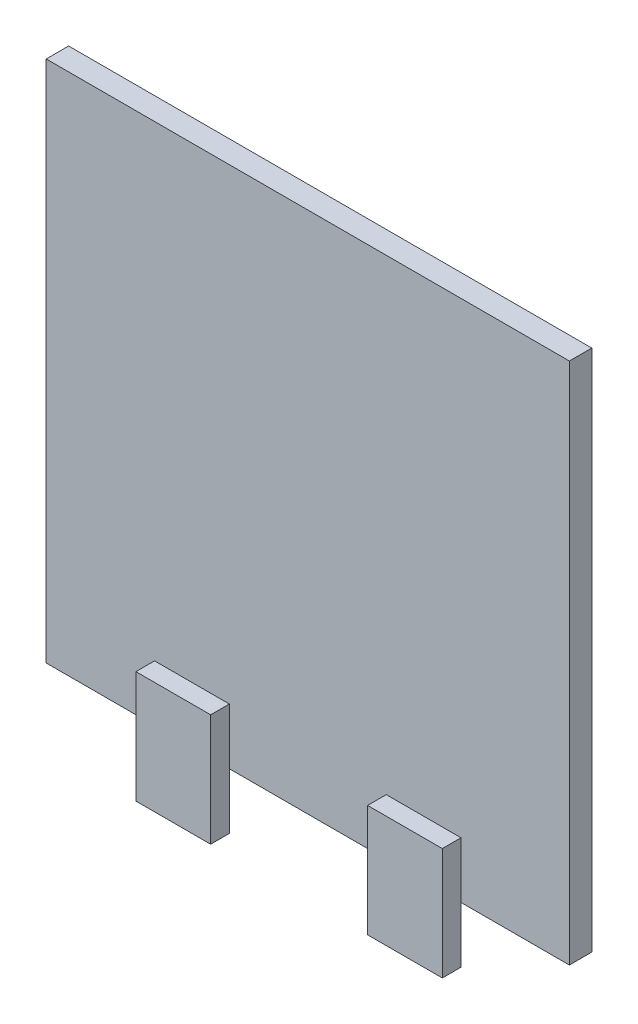
ISO-10303-21;
HEADER;
FILE_DESCRIPTION(('STEP AP214'),'2;1');
FILE_NAME('part.step','',(''),(''),'','','');
FILE_SCHEMA(('AUTOMOTIVE_DESIGN { 1 0 10303 214 1 1 1 1 }'));
ENDSEC;
DATA;
#1=APPLICATION_CONTEXT('core data for automotive mechanical design processes');
#2=APPLICATION_PROTOCOL_DEFINITION('international standard','automotive_design',2000,#1);
#3=PRODUCT_CONTEXT('',#1,'mechanical');
#4=PRODUCT('Part','Part','',(#3));
#5=PRODUCT_RELATED_PRODUCT_CATEGORY('part','',(#4));
#6=PRODUCT_DEFINITION_FORMATION('','',#4);
#7=PRODUCT_DEFINITION_CONTEXT('part definition',#1,'design');
#8=PRODUCT_DEFINITION('design','',#6,#7);
#9=PRODUCT_DEFINITION_SHAPE('','',#8);
#10=(LENGTH_UNIT() NAMED_UNIT(*) SI_UNIT(.MILLI.,.METRE.));
#11=(NAMED_UNIT(*) PLANE_ANGLE_UNIT() SI_UNIT($,.RADIAN.));
#12=(NAMED_UNIT(*) SI_UNIT($,.STERADIAN.) SOLID_ANGLE_UNIT());
#13=UNCERTAINTY_MEASURE_WITH_UNIT(LENGTH_MEASURE(1.E-05),#10,'distance_accuracy_value','');
#14=(GEOMETRIC_REPRESENTATION_CONTEXT(3) GLOBAL_UNCERTAINTY_ASSIGNED_CONTEXT((#13)) GLOBAL_UNIT_ASSIGNED_CONTEXT((#10,
#11,#12)) REPRESENTATION_CONTEXT('',''));
#15=CARTESIAN_POINT('',(0.,0.,0.));
#16=DIRECTION('',(0.,0.,1.));
#17=DIRECTION('',(1.,0.,0.));
#18=AXIS2_PLACEMENT_3D('',#15,#16,#17);
#19=CARTESIAN_POINT('',(70.,-69.9999999999999,6.));
#20=DIRECTION('',(-1.,0.,0.));
#21=DIRECTION('',(0.,0.,1.));
#22=AXIS2_PLACEMENT_3D('',#19,#20,#21);
#23=PLANE('',#22);
#24=DIRECTION('',(0.,1.,0.));
#25=VECTOR('',#24,1.);
#26=CARTESIAN_POINT('',(70.,-69.9999999999999,0.));
#27=LINE('',#26,#25);
#28=CARTESIAN_POINT('',(70.,-69.9999999999999,0.));
#29=VERTEX_POINT('',#28);
#30=CARTESIAN_POINT('',(70.,70.0000000000001,0.));
#31=VERTEX_POINT('',#30);
#32=EDGE_CURVE('E163',#29,#31,#27,.T.);
#33=ORIENTED_EDGE('',*,*,#32,.T.);
#34=DIRECTION('',(0.,0.,-1.));
#35=VECTOR('',#34,1.);
#36=CARTESIAN_POINT('',(70.,70.0000000000001,6.));
#37=LINE('',#36,#35);
#38=CARTESIAN_POINT('',(70.,70.0000000000001,6.));
#39=VERTEX_POINT('',#38);
#40=EDGE_CURVE('E42',#39,#31,#37,.T.);
#41=ORIENTED_EDGE('',*,*,#40,.F.);
#42=DIRECTION('',(0.,1.,0.));
#43=VECTOR('',#42,1.);
#44=CARTESIAN_POINT('',(70.,-69.9999999999999,6.));
#45=LINE('',#44,#43);
#46=CARTESIAN_POINT('',(70.,-69.9999999999999,6.));
#47=VERTEX_POINT('',#46);
#48=EDGE_CURVE('E203',#47,#39,#45,.T.);
#49=ORIENTED_EDGE('',*,*,#48,.F.);
#50=DIRECTION('',(0.,0.,-1.));
#51=VECTOR('',#50,1.);
#52=CARTESIAN_POINT('',(70.,-69.9999999999999,6.));
#53=LINE('',#52,#51);
#54=EDGE_CURVE('E214',#47,#29,#53,.T.);
#55=ORIENTED_EDGE('',*,*,#54,.T.);
#56=EDGE_LOOP('',(#33,#41,#49,#55));
#57=FACE_BOUND('',#56,.T.);
#58=ADVANCED_FACE('F39',(#57),#23,.F.);
#59=CARTESIAN_POINT('',(70.,70.0000000000001,6.));
#60=DIRECTION('',(0.,-1.,0.));
#61=DIRECTION('',(0.,0.,-1.));
#62=AXIS2_PLACEMENT_3D('',#59,#60,#61);
#63=PLANE('',#62);
#64=DIRECTION('',(-1.,0.,0.));
#65=VECTOR('',#64,1.);
#66=CARTESIAN_POINT('',(70.,70.0000000000001,0.));
#67=LINE('',#66,#65);
#68=CARTESIAN_POINT('',(-70.,70.0000000000001,0.));
#69=VERTEX_POINT('',#68);
#70=EDGE_CURVE('E166',#31,#69,#67,.T.);
#71=ORIENTED_EDGE('',*,*,#70,.T.);
#72=DIRECTION('',(0.,0.,-1.));
#73=VECTOR('',#72,1.);
#74=CARTESIAN_POINT('',(-70.,70.0000000000001,6.));
#75=LINE('',#74,#73);
#76=CARTESIAN_POINT('',(-70.,70.0000000000001,6.));
#77=VERTEX_POINT('',#76);
#78=EDGE_CURVE('E225',#77,#69,#75,.T.);
#79=ORIENTED_EDGE('',*,*,#78,.F.);
#80=DIRECTION('',(-1.,0.,0.));
#81=VECTOR('',#80,1.);
#82=CARTESIAN_POINT('',(70.,70.0000000000001,6.));
#83=LINE('',#82,#81);
#84=EDGE_CURVE('E206',#39,#77,#83,.T.);
#85=ORIENTED_EDGE('',*,*,#84,.F.);
#86=ORIENTED_EDGE('',*,*,#40,.T.);
#87=EDGE_LOOP('',(#71,#79,#85,#86));
#88=FACE_BOUND('',#87,.T.);
#89=ADVANCED_FACE('F269',(#88),#63,.F.);
#90=CARTESIAN_POINT('',(-70.,-69.9999999999999,6.));
#91=DIRECTION('',(1.,0.,0.));
#92=DIRECTION('',(0.,0.,-1.));
#93=AXIS2_PLACEMENT_3D('',#90,#91,#92);
#94=PLANE('',#93);
#95=DIRECTION('',(0.,-1.,0.));
#96=VECTOR('',#95,1.);
#97=CARTESIAN_POINT('',(-70.,-69.9999999999999,0.));
#98=LINE('',#97,#96);
#99=CARTESIAN_POINT('',(-70.,-69.9999999999999,0.));
#100=VERTEX_POINT('',#99);
#101=EDGE_CURVE('E218',#69,#100,#98,.T.);
#102=ORIENTED_EDGE('',*,*,#101,.T.);
#103=DIRECTION('',(0.,0.,-1.));
#104=VECTOR('',#103,1.);
#105=CARTESIAN_POINT('',(-70.,-69.9999999999999,6.));
#106=LINE('',#105,#104);
#107=CARTESIAN_POINT('',(-70.,-69.9999999999999,6.));
#108=VERTEX_POINT('',#107);
#109=EDGE_CURVE('E223',#108,#100,#106,.T.);
#110=ORIENTED_EDGE('',*,*,#109,.F.);
#111=DIRECTION('',(0.,-1.,0.));
#112=VECTOR('',#111,1.);
#113=CARTESIAN_POINT('',(-70.,-69.9999999999999,6.));
#114=LINE('',#113,#112);
#115=EDGE_CURVE('E209',#77,#108,#114,.T.);
#116=ORIENTED_EDGE('',*,*,#115,.F.);
#117=ORIENTED_EDGE('',*,*,#78,.T.);
#118=EDGE_LOOP('',(#102,#110,#116,#117));
#119=FACE_BOUND('',#118,.T.);
#120=ADVANCED_FACE('F271',(#119),#94,.F.);
#121=CARTESIAN_POINT('',(70.,-69.9999999999999,6.));
#122=DIRECTION('',(0.,1.,0.));
#123=DIRECTION('',(0.,0.,1.));
#124=AXIS2_PLACEMENT_3D('',#121,#122,#123);
#125=PLANE('',#124);
#126=DIRECTION('',(1.,0.,0.));
#127=VECTOR('',#126,1.);
#128=CARTESIAN_POINT('',(70.,-69.9999999999999,0.));
#129=LINE('',#128,#127);
#130=EDGE_CURVE('E207',#100,#29,#129,.T.);
#131=ORIENTED_EDGE('',*,*,#130,.T.);
#132=ORIENTED_EDGE('',*,*,#54,.F.);
#133=DIRECTION('',(1.,0.,0.));
#134=VECTOR('',#133,1.);
#135=CARTESIAN_POINT('',(70.,-69.9999999999999,6.));
#136=LINE('',#135,#134);
#137=CARTESIAN_POINT('',(40.9999999999992,-69.9999999999999,6.));
#138=VERTEX_POINT('',#137);
#139=EDGE_CURVE('E211',#138,#47,#136,.T.);
#140=ORIENTED_EDGE('',*,*,#139,.F.);
#141=CARTESIAN_POINT('',(20.9999999999992,-69.9999999999999,6.));
#142=VERTEX_POINT('',#141);
#143=EDGE_CURVE('E256',#142,#138,#136,.T.);
#144=ORIENTED_EDGE('',*,*,#143,.F.);
#145=CARTESIAN_POINT('',(-20.9999999999992,-69.9999999999999,6.));
#146=VERTEX_POINT('',#145);
#147=EDGE_CURVE('E259',#146,#142,#136,.T.);
#148=ORIENTED_EDGE('',*,*,#147,.F.);
#149=CARTESIAN_POINT('',(-40.9999999999992,-69.9999999999999,6.));
#150=VERTEX_POINT('',#149);
#151=EDGE_CURVE('E215',#150,#146,#136,.T.);
#152=ORIENTED_EDGE('',*,*,#151,.F.);
#153=EDGE_CURVE('E212',#108,#150,#136,.T.);
#154=ORIENTED_EDGE('',*,*,#153,.F.);
#155=ORIENTED_EDGE('',*,*,#109,.T.);
#156=EDGE_LOOP('',(#131,#132,#140,#144,#148,#152,#154,#155));
#157=FACE_BOUND('',#156,.T.);
#158=ADVANCED_FACE('F263',(#157),#125,.F.);
#159=CARTESIAN_POINT('',(0.,0.,6.));
#160=DIRECTION('',(0.,0.,1.));
#161=DIRECTION('',(1.,0.,0.));
#162=AXIS2_PLACEMENT_3D('',#159,#160,#161);
#163=PLANE('',#162);
#164=DIRECTION('',(0.,1.,0.));
#165=VECTOR('',#164,1.);
#166=CARTESIAN_POINT('',(-20.9999999999992,-54.9999999999999,6.));
#167=LINE('',#166,#165);
#168=CARTESIAN_POINT('',(-20.9999999999992,-54.9999999999999,6.));
#169=VERTEX_POINT('',#168);
#170=EDGE_CURVE('E11',#146,#169,#167,.T.);
#171=ORIENTED_EDGE('',*,*,#170,.F.);
#172=ORIENTED_EDGE('',*,*,#147,.T.);
#173=DIRECTION('',(0.,-1.,0.));
#174=VECTOR('',#173,1.);
#175=CARTESIAN_POINT('',(20.9999999999992,-54.9999999999999,6.));
#176=LINE('',#175,#174);
#177=CARTESIAN_POINT('',(20.9999999999992,-54.9999999999999,6.));
#178=VERTEX_POINT('',#177);
#179=EDGE_CURVE('E192',#178,#142,#176,.T.);
#180=ORIENTED_EDGE('',*,*,#179,.F.);
#181=DIRECTION('',(-1.,0.,0.));
#182=VECTOR('',#181,1.);
#183=CARTESIAN_POINT('',(40.9999999999992,-54.9999999999999,6.));
#184=LINE('',#183,#182);
#185=CARTESIAN_POINT('',(40.9999999999992,-54.9999999999999,6.));
#186=VERTEX_POINT('',#185);
#187=EDGE_CURVE('E62',#186,#178,#184,.T.);
#188=ORIENTED_EDGE('',*,*,#187,.F.);
#189=DIRECTION('',(0.,1.,0.));
#190=VECTOR('',#189,1.);
#191=CARTESIAN_POINT('',(40.9999999999992,-54.9999999999999,6.));
#192=LINE('',#191,#190);
#193=EDGE_CURVE('E47',#138,#186,#192,.T.);
#194=ORIENTED_EDGE('',*,*,#193,.F.);
#195=ORIENTED_EDGE('',*,*,#139,.T.);
#196=ORIENTED_EDGE('',*,*,#48,.T.);
#197=ORIENTED_EDGE('',*,*,#84,.T.);
#198=ORIENTED_EDGE('',*,*,#115,.T.);
#199=ORIENTED_EDGE('',*,*,#153,.T.);
#200=DIRECTION('',(0.,-1.,0.));
#201=VECTOR('',#200,1.);
#202=CARTESIAN_POINT('',(-40.9999999999992,-54.9999999999999,6.));
#203=LINE('',#202,#201);
#204=CARTESIAN_POINT('',(-40.9999999999992,-54.9999999999999,6.));
#205=VERTEX_POINT('',#204);
#206=EDGE_CURVE('E275',#205,#150,#203,.T.);
#207=ORIENTED_EDGE('',*,*,#206,.F.);
#208=DIRECTION('',(-1.,0.,0.));
#209=VECTOR('',#208,1.);
#210=CARTESIAN_POINT('',(-40.9999999999992,-54.9999999999999,6.));
#211=LINE('',#210,#209);
#212=EDGE_CURVE('E56',#169,#205,#211,.T.);
#213=ORIENTED_EDGE('',*,*,#212,.F.);
#214=EDGE_LOOP('',(#171,#172,#180,#188,#194,#195,#196,#197,#198,#199,#207,#213));
#215=FACE_BOUND('',#214,.T.);
#216=ADVANCED_FACE('F261',(#215),#163,.T.);
#217=CARTESIAN_POINT('',(0.,0.,0.));
#218=DIRECTION('',(0.,0.,1.));
#219=DIRECTION('',(1.,0.,0.));
#220=AXIS2_PLACEMENT_3D('',#217,#218,#219);
#221=PLANE('',#220);
#222=ORIENTED_EDGE('',*,*,#32,.F.);
#223=ORIENTED_EDGE('',*,*,#130,.F.);
#224=ORIENTED_EDGE('',*,*,#101,.F.);
#225=ORIENTED_EDGE('',*,*,#70,.F.);
#226=EDGE_LOOP('',(#222,#223,#224,#225));
#227=FACE_BOUND('',#226,.T.);
#228=ADVANCED_FACE('F268',(#227),#221,.F.);
#229=CARTESIAN_POINT('',(0.,0.,6.));
#230=DIRECTION('',(0.,0.,1.));
#231=DIRECTION('',(1.,0.,0.));
#232=AXIS2_PLACEMENT_3D('',#229,#230,#231);
#233=PLANE('',#232);
#234=CARTESIAN_POINT('',(20.9999999999992,-84.9999999999999,6.));
#235=VERTEX_POINT('',#234);
#236=EDGE_CURVE('E191',#142,#235,#176,.T.);
#237=ORIENTED_EDGE('',*,*,#236,.F.);
#238=ORIENTED_EDGE('',*,*,#143,.T.);
#239=CARTESIAN_POINT('',(40.9999999999992,-84.9999999999999,6.));
#240=VERTEX_POINT('',#239);
#241=EDGE_CURVE('E185',#240,#138,#192,.T.);
#242=ORIENTED_EDGE('',*,*,#241,.F.);
#243=DIRECTION('',(1.,0.,0.));
#244=VECTOR('',#243,1.);
#245=CARTESIAN_POINT('',(40.9999999999992,-84.9999999999999,6.));
#246=LINE('',#245,#244);
#247=EDGE_CURVE('E188',#235,#240,#246,.T.);
#248=ORIENTED_EDGE('',*,*,#247,.F.);
#249=EDGE_LOOP('',(#237,#238,#242,#248));
#250=FACE_BOUND('',#249,.T.);
#251=ADVANCED_FACE('F254',(#250),#233,.F.);
#252=CARTESIAN_POINT('',(40.9999999999992,-54.9999999999999,11.));
#253=DIRECTION('',(0.,-1.,0.));
#254=DIRECTION('',(0.,0.,-1.));
#255=AXIS2_PLACEMENT_3D('',#252,#253,#254);
#256=PLANE('',#255);
#257=ORIENTED_EDGE('',*,*,#187,.T.);
#258=DIRECTION('',(0.,0.,-1.));
#259=VECTOR('',#258,1.);
#260=CARTESIAN_POINT('',(20.9999999999992,-54.9999999999999,11.));
#261=LINE('',#260,#259);
#262=CARTESIAN_POINT('',(20.9999999999992,-54.9999999999999,11.));
#263=VERTEX_POINT('',#262);
#264=EDGE_CURVE('E172',#263,#178,#261,.T.);
#265=ORIENTED_EDGE('',*,*,#264,.F.);
#266=DIRECTION('',(-1.,0.,0.));
#267=VECTOR('',#266,1.);
#268=CARTESIAN_POINT('',(40.9999999999992,-54.9999999999999,11.));
#269=LINE('',#268,#267);
#270=CARTESIAN_POINT('',(40.9999999999992,-54.9999999999999,11.));
#271=VERTEX_POINT('',#270);
#272=EDGE_CURVE('E189',#271,#263,#269,.T.);
#273=ORIENTED_EDGE('',*,*,#272,.F.);
#274=DIRECTION('',(0.,0.,-1.));
#275=VECTOR('',#274,1.);
#276=CARTESIAN_POINT('',(40.9999999999992,-54.9999999999999,11.));
#277=LINE('',#276,#275);
#278=EDGE_CURVE('E181',#271,#186,#277,.T.);
#279=ORIENTED_EDGE('',*,*,#278,.T.);
#280=EDGE_LOOP('',(#257,#265,#273,#279));
#281=FACE_BOUND('',#280,.T.);
#282=ADVANCED_FACE('F242',(#281),#256,.F.);
#283=CARTESIAN_POINT('',(20.9999999999992,-54.9999999999999,11.));
#284=DIRECTION('',(1.,0.,0.));
#285=DIRECTION('',(0.,1.,0.));
#286=AXIS2_PLACEMENT_3D('',#283,#284,#285);
#287=PLANE('',#286);
#288=ORIENTED_EDGE('',*,*,#179,.T.);
#289=ORIENTED_EDGE('',*,*,#236,.T.);
#290=DIRECTION('',(0.,0.,-1.));
#291=VECTOR('',#290,1.);
#292=CARTESIAN_POINT('',(20.9999999999992,-84.9999999999999,11.));
#293=LINE('',#292,#291);
#294=CARTESIAN_POINT('',(20.9999999999992,-84.9999999999999,11.));
#295=VERTEX_POINT('',#294);
#296=EDGE_CURVE('E175',#295,#235,#293,.T.);
#297=ORIENTED_EDGE('',*,*,#296,.F.);
#298=DIRECTION('',(0.,-1.,0.));
#299=VECTOR('',#298,1.);
#300=CARTESIAN_POINT('',(20.9999999999992,-54.9999999999999,11.));
#301=LINE('',#300,#299);
#302=EDGE_CURVE('E199',#263,#295,#301,.T.);
#303=ORIENTED_EDGE('',*,*,#302,.F.);
#304=ORIENTED_EDGE('',*,*,#264,.T.);
#305=EDGE_LOOP('',(#288,#289,#297,#303,#304));
#306=FACE_BOUND('',#305,.T.);
#307=ADVANCED_FACE('F328',(#306),#287,.F.);
#308=CARTESIAN_POINT('',(40.9999999999992,-84.9999999999999,11.));
#309=DIRECTION('',(0.,1.,0.));
#310=DIRECTION('',(0.,0.,1.));
#311=AXIS2_PLACEMENT_3D('',#308,#309,#310);
#312=PLANE('',#311);
#313=ORIENTED_EDGE('',*,*,#247,.T.);
#314=DIRECTION('',(0.,0.,-1.));
#315=VECTOR('',#314,1.);
#316=CARTESIAN_POINT('',(40.9999999999992,-84.9999999999999,11.));
#317=LINE('',#316,#315);
#318=CARTESIAN_POINT('',(40.9999999999992,-84.9999999999999,11.));
#319=VERTEX_POINT('',#318);
#320=EDGE_CURVE('E178',#319,#240,#317,.T.);
#321=ORIENTED_EDGE('',*,*,#320,.F.);
#322=DIRECTION('',(1.,0.,0.));
#323=VECTOR('',#322,1.);
#324=CARTESIAN_POINT('',(40.9999999999992,-84.9999999999999,11.));
#325=LINE('',#324,#323);
#326=EDGE_CURVE('E197',#295,#319,#325,.T.);
#327=ORIENTED_EDGE('',*,*,#326,.F.);
#328=ORIENTED_EDGE('',*,*,#296,.T.);
#329=EDGE_LOOP('',(#313,#321,#327,#328));
#330=FACE_BOUND('',#329,.T.);
#331=ADVANCED_FACE('F325',(#330),#312,.F.);
#332=CARTESIAN_POINT('',(40.9999999999992,-54.9999999999999,11.));
#333=DIRECTION('',(-1.,0.,0.));
#334=DIRECTION('',(0.,0.,1.));
#335=AXIS2_PLACEMENT_3D('',#332,#333,#334);
#336=PLANE('',#335);
#337=ORIENTED_EDGE('',*,*,#241,.T.);
#338=ORIENTED_EDGE('',*,*,#193,.T.);
#339=ORIENTED_EDGE('',*,*,#278,.F.);
#340=DIRECTION('',(0.,1.,0.));
#341=VECTOR('',#340,1.);
#342=CARTESIAN_POINT('',(40.9999999999992,-54.9999999999999,11.));
#343=LINE('',#342,#341);
#344=EDGE_CURVE('E184',#319,#271,#343,.T.);
#345=ORIENTED_EDGE('',*,*,#344,.F.);
#346=ORIENTED_EDGE('',*,*,#320,.T.);
#347=EDGE_LOOP('',(#337,#338,#339,#345,#346));
#348=FACE_BOUND('',#347,.T.);
#349=ADVANCED_FACE('F236',(#348),#336,.F.);
#350=CARTESIAN_POINT('',(0.,0.,11.));
#351=DIRECTION('',(0.,0.,1.));
#352=DIRECTION('',(1.,0.,0.));
#353=AXIS2_PLACEMENT_3D('',#350,#351,#352);
#354=PLANE('',#353);
#355=ORIENTED_EDGE('',*,*,#272,.T.);
#356=ORIENTED_EDGE('',*,*,#302,.T.);
#357=ORIENTED_EDGE('',*,*,#326,.T.);
#358=ORIENTED_EDGE('',*,*,#344,.T.);
#359=EDGE_LOOP('',(#355,#356,#357,#358));
#360=FACE_BOUND('',#359,.T.);
#361=ADVANCED_FACE('F245',(#360),#354,.T.);
#362=CARTESIAN_POINT('',(0.,0.,6.));
#363=DIRECTION('',(0.,0.,1.));
#364=DIRECTION('',(1.,0.,0.));
#365=AXIS2_PLACEMENT_3D('',#362,#363,#364);
#366=PLANE('',#365);
#367=CARTESIAN_POINT('',(-40.9999999999992,-84.9999999999999,6.));
#368=VERTEX_POINT('',#367);
#369=EDGE_CURVE('E279',#150,#368,#203,.T.);
#370=ORIENTED_EDGE('',*,*,#369,.F.);
#371=ORIENTED_EDGE('',*,*,#151,.T.);
#372=CARTESIAN_POINT('',(-20.9999999999992,-84.9999999999999,6.));
#373=VERTEX_POINT('',#372);
#374=EDGE_CURVE('E49',#373,#146,#167,.T.);
#375=ORIENTED_EDGE('',*,*,#374,.F.);
#376=DIRECTION('',(1.,0.,0.));
#377=VECTOR('',#376,1.);
#378=CARTESIAN_POINT('',(-40.9999999999992,-84.9999999999999,6.));
#379=LINE('',#378,#377);
#380=EDGE_CURVE('E159',#368,#373,#379,.T.);
#381=ORIENTED_EDGE('',*,*,#380,.F.);
#382=EDGE_LOOP('',(#370,#371,#375,#381));
#383=FACE_BOUND('',#382,.T.);
#384=ADVANCED_FACE('F280',(#383),#366,.F.);
#385=CARTESIAN_POINT('',(-20.9999999999992,-54.9999999999999,11.));
#386=DIRECTION('',(-1.,0.,0.));
#387=DIRECTION('',(0.,-1.,0.));
#388=AXIS2_PLACEMENT_3D('',#385,#386,#387);
#389=PLANE('',#388);
#390=ORIENTED_EDGE('',*,*,#374,.T.);
#391=ORIENTED_EDGE('',*,*,#170,.T.);
#392=DIRECTION('',(0.,0.,-1.));
#393=VECTOR('',#392,1.);
#394=CARTESIAN_POINT('',(-20.9999999999992,-54.9999999999999,11.));
#395=LINE('',#394,#393);
#396=CARTESIAN_POINT('',(-20.9999999999992,-54.9999999999999,11.));
#397=VERTEX_POINT('',#396);
#398=EDGE_CURVE('E144',#397,#169,#395,.T.);
#399=ORIENTED_EDGE('',*,*,#398,.F.);
#400=DIRECTION('',(0.,1.,0.));
#401=VECTOR('',#400,1.);
#402=CARTESIAN_POINT('',(-20.9999999999992,-54.9999999999999,11.));
#403=LINE('',#402,#401);
#404=CARTESIAN_POINT('',(-20.9999999999992,-84.9999999999999,11.));
#405=VERTEX_POINT('',#404);
#406=EDGE_CURVE('E150',#405,#397,#403,.T.);
#407=ORIENTED_EDGE('',*,*,#406,.F.);
#408=DIRECTION('',(0.,0.,-1.));
#409=VECTOR('',#408,1.);
#410=CARTESIAN_POINT('',(-20.9999999999992,-84.9999999999999,11.));
#411=LINE('',#410,#409);
#412=EDGE_CURVE('E290',#405,#373,#411,.T.);
#413=ORIENTED_EDGE('',*,*,#412,.T.);
#414=EDGE_LOOP('',(#390,#391,#399,#407,#413));
#415=FACE_BOUND('',#414,.T.);
#416=ADVANCED_FACE('F162',(#415),#389,.F.);
#417=CARTESIAN_POINT('',(-40.9999999999992,-54.9999999999999,11.));
#418=DIRECTION('',(0.,-1.,0.));
#419=DIRECTION('',(0.,0.,-1.));
#420=AXIS2_PLACEMENT_3D('',#417,#418,#419);
#421=PLANE('',#420);
#422=ORIENTED_EDGE('',*,*,#212,.T.);
#423=DIRECTION('',(0.,0.,-1.));
#424=VECTOR('',#423,1.);
#425=CARTESIAN_POINT('',(-40.9999999999992,-54.9999999999999,11.));
#426=LINE('',#425,#424);
#427=CARTESIAN_POINT('',(-40.9999999999992,-54.9999999999999,11.));
#428=VERTEX_POINT('',#427);
#429=EDGE_CURVE('E146',#428,#205,#426,.T.);
#430=ORIENTED_EDGE('',*,*,#429,.F.);
#431=DIRECTION('',(-1.,0.,0.));
#432=VECTOR('',#431,1.);
#433=CARTESIAN_POINT('',(-40.9999999999992,-54.9999999999999,11.));
#434=LINE('',#433,#432);
#435=EDGE_CURVE('E140',#397,#428,#434,.T.);
#436=ORIENTED_EDGE('',*,*,#435,.F.);
#437=ORIENTED_EDGE('',*,*,#398,.T.);
#438=EDGE_LOOP('',(#422,#430,#436,#437));
#439=FACE_BOUND('',#438,.T.);
#440=ADVANCED_FACE('F142',(#439),#421,.F.);
#441=CARTESIAN_POINT('',(-40.9999999999992,-54.9999999999999,11.));
#442=DIRECTION('',(1.,0.,0.));
#443=DIRECTION('',(0.,0.,-1.));
#444=AXIS2_PLACEMENT_3D('',#441,#442,#443);
#445=PLANE('',#444);
#446=ORIENTED_EDGE('',*,*,#206,.T.);
#447=ORIENTED_EDGE('',*,*,#369,.T.);
#448=DIRECTION('',(0.,0.,-1.));
#449=VECTOR('',#448,1.);
#450=CARTESIAN_POINT('',(-40.9999999999992,-84.9999999999999,11.));
#451=LINE('',#450,#449);
#452=CARTESIAN_POINT('',(-40.9999999999992,-84.9999999999999,11.));
#453=VERTEX_POINT('',#452);
#454=EDGE_CURVE('E168',#453,#368,#451,.T.);
#455=ORIENTED_EDGE('',*,*,#454,.F.);
#456=DIRECTION('',(0.,-1.,0.));
#457=VECTOR('',#456,1.);
#458=CARTESIAN_POINT('',(-40.9999999999992,-54.9999999999999,11.));
#459=LINE('',#458,#457);
#460=EDGE_CURVE('E149',#428,#453,#459,.T.);
#461=ORIENTED_EDGE('',*,*,#460,.F.);
#462=ORIENTED_EDGE('',*,*,#429,.T.);
#463=EDGE_LOOP('',(#446,#447,#455,#461,#462));
#464=FACE_BOUND('',#463,.T.);
#465=ADVANCED_FACE('F286',(#464),#445,.F.);
#466=CARTESIAN_POINT('',(-40.9999999999992,-84.9999999999999,11.));
#467=DIRECTION('',(0.,1.,0.));
#468=DIRECTION('',(0.,0.,1.));
#469=AXIS2_PLACEMENT_3D('',#466,#467,#468);
#470=PLANE('',#469);
#471=ORIENTED_EDGE('',*,*,#380,.T.);
#472=ORIENTED_EDGE('',*,*,#412,.F.);
#473=DIRECTION('',(1.,0.,0.));
#474=VECTOR('',#473,1.);
#475=CARTESIAN_POINT('',(-40.9999999999992,-84.9999999999999,11.));
#476=LINE('',#475,#474);
#477=EDGE_CURVE('E155',#453,#405,#476,.T.);
#478=ORIENTED_EDGE('',*,*,#477,.F.);
#479=ORIENTED_EDGE('',*,*,#454,.T.);
#480=EDGE_LOOP('',(#471,#472,#478,#479));
#481=FACE_BOUND('',#480,.T.);
#482=ADVANCED_FACE('F292',(#481),#470,.F.);
#483=CARTESIAN_POINT('',(0.,0.,11.));
#484=DIRECTION('',(0.,0.,1.));
#485=DIRECTION('',(1.,0.,0.));
#486=AXIS2_PLACEMENT_3D('',#483,#484,#485);
#487=PLANE('',#486);
#488=ORIENTED_EDGE('',*,*,#406,.T.);
#489=ORIENTED_EDGE('',*,*,#435,.T.);
#490=ORIENTED_EDGE('',*,*,#460,.T.);
#491=ORIENTED_EDGE('',*,*,#477,.T.);
#492=EDGE_LOOP('',(#488,#489,#490,#491));
#493=FACE_BOUND('',#492,.T.);
#494=ADVANCED_FACE('F153',(#493),#487,.T.);
#495=CLOSED_SHELL('',(#58,#89,#120,#158,#216,#228,#251,#282,#307,#331,#349,#361,#384,#416,#440,
#465,#482,#494));
#496=MANIFOLD_SOLID_BREP('B2',#495);
#497=ADVANCED_BREP_SHAPE_REPRESENTATION('',(#18,#496),#14);
#498=SHAPE_DEFINITION_REPRESENTATION(#9,#497);
ENDSEC;
END-ISO-10303-21;
